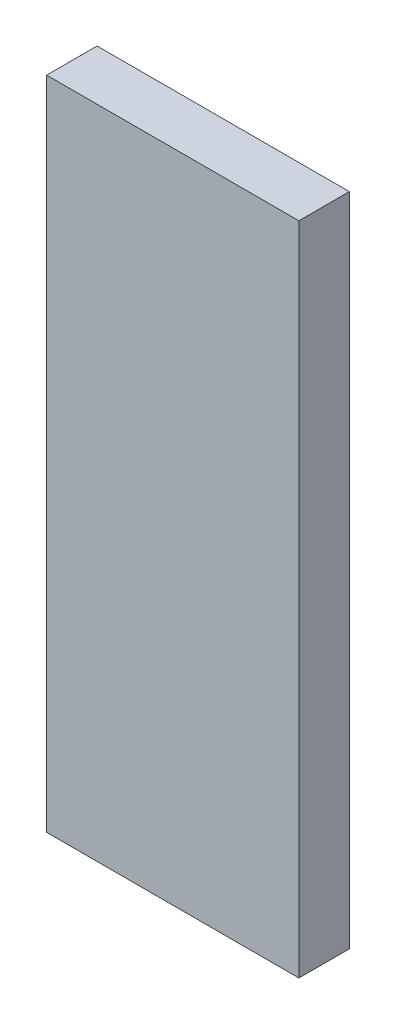
ISO-10303-21;
HEADER;
FILE_DESCRIPTION(('STEP AP214'),'2;1');
FILE_NAME('part.step','',(''),(''),'','','');
FILE_SCHEMA(('AUTOMOTIVE_DESIGN { 1 0 10303 214 1 1 1 1 }'));
ENDSEC;
DATA;
#1=APPLICATION_CONTEXT('core data for automotive mechanical design processes');
#2=APPLICATION_PROTOCOL_DEFINITION('international standard','automotive_design',2000,#1);
#3=PRODUCT_CONTEXT('',#1,'mechanical');
#4=PRODUCT('Part','Part','',(#3));
#5=PRODUCT_RELATED_PRODUCT_CATEGORY('part','',(#4));
#6=PRODUCT_DEFINITION_FORMATION('','',#4);
#7=PRODUCT_DEFINITION_CONTEXT('part definition',#1,'design');
#8=PRODUCT_DEFINITION('design','',#6,#7);
#9=PRODUCT_DEFINITION_SHAPE('','',#8);
#10=(LENGTH_UNIT() NAMED_UNIT(*) SI_UNIT(.MILLI.,.METRE.));
#11=(NAMED_UNIT(*) PLANE_ANGLE_UNIT() SI_UNIT($,.RADIAN.));
#12=(NAMED_UNIT(*) SI_UNIT($,.STERADIAN.) SOLID_ANGLE_UNIT());
#13=UNCERTAINTY_MEASURE_WITH_UNIT(LENGTH_MEASURE(1.E-05),#10,'distance_accuracy_value','');
#14=(GEOMETRIC_REPRESENTATION_CONTEXT(3) GLOBAL_UNCERTAINTY_ASSIGNED_CONTEXT((#13)) GLOBAL_UNIT_ASSIGNED_CONTEXT((#10,
#11,#12)) REPRESENTATION_CONTEXT('',''));
#15=CARTESIAN_POINT('',(0.,0.,0.));
#16=DIRECTION('',(0.,0.,1.));
#17=DIRECTION('',(1.,0.,0.));
#18=AXIS2_PLACEMENT_3D('',#15,#16,#17);
#19=CARTESIAN_POINT('',(-12.5,65.,2.5));
#20=DIRECTION('',(1.,0.,0.));
#21=DIRECTION('',(0.,0.,-1.));
#22=AXIS2_PLACEMENT_3D('',#19,#20,#21);
#23=PLANE('',#22);
#24=DIRECTION('',(0.,0.,1.));
#25=VECTOR('',#24,1.);
#26=CARTESIAN_POINT('',(-12.5,0.,2.5));
#27=LINE('',#26,#25);
#28=CARTESIAN_POINT('',(-12.5,0.,-2.5));
#29=VERTEX_POINT('',#28);
#30=CARTESIAN_POINT('',(-12.5,0.,2.5));
#31=VERTEX_POINT('',#30);
#32=EDGE_CURVE('E104',#29,#31,#27,.T.);
#33=ORIENTED_EDGE('',*,*,#32,.T.);
#34=DIRECTION('',(0.,-1.,0.));
#35=VECTOR('',#34,1.);
#36=CARTESIAN_POINT('',(-12.5,65.,2.5));
#37=LINE('',#36,#35);
#38=CARTESIAN_POINT('',(-12.5,65.,2.5));
#39=VERTEX_POINT('',#38);
#40=EDGE_CURVE('E11',#39,#31,#37,.T.);
#41=ORIENTED_EDGE('',*,*,#40,.F.);
#42=DIRECTION('',(0.,0.,1.));
#43=VECTOR('',#42,1.);
#44=CARTESIAN_POINT('',(-12.5,65.,2.5));
#45=LINE('',#44,#43);
#46=CARTESIAN_POINT('',(-12.5,65.,-2.5));
#47=VERTEX_POINT('',#46);
#48=EDGE_CURVE('E92',#47,#39,#45,.T.);
#49=ORIENTED_EDGE('',*,*,#48,.F.);
#50=DIRECTION('',(0.,-1.,0.));
#51=VECTOR('',#50,1.);
#52=CARTESIAN_POINT('',(-12.5,65.,-2.5));
#53=LINE('',#52,#51);
#54=EDGE_CURVE('E100',#47,#29,#53,.T.);
#55=ORIENTED_EDGE('',*,*,#54,.T.);
#56=EDGE_LOOP('',(#33,#41,#49,#55));
#57=FACE_BOUND('',#56,.T.);
#58=ADVANCED_FACE('F41',(#57),#23,.F.);
#59=CARTESIAN_POINT('',(12.5,65.,2.5));
#60=DIRECTION('',(0.,0.,-1.));
#61=DIRECTION('',(-1.,0.,0.));
#62=AXIS2_PLACEMENT_3D('',#59,#60,#61);
#63=PLANE('',#62);
#64=DIRECTION('',(1.,0.,0.));
#65=VECTOR('',#64,1.);
#66=CARTESIAN_POINT('',(12.5,0.,2.5));
#67=LINE('',#66,#65);
#68=CARTESIAN_POINT('',(12.5,0.,2.5));
#69=VERTEX_POINT('',#68);
#70=EDGE_CURVE('E96',#31,#69,#67,.T.);
#71=ORIENTED_EDGE('',*,*,#70,.T.);
#72=DIRECTION('',(0.,-1.,0.));
#73=VECTOR('',#72,1.);
#74=CARTESIAN_POINT('',(12.5,65.,2.5));
#75=LINE('',#74,#73);
#76=CARTESIAN_POINT('',(12.5,65.,2.5));
#77=VERTEX_POINT('',#76);
#78=EDGE_CURVE('E49',#77,#69,#75,.T.);
#79=ORIENTED_EDGE('',*,*,#78,.F.);
#80=DIRECTION('',(1.,0.,0.));
#81=VECTOR('',#80,1.);
#82=CARTESIAN_POINT('',(12.5,65.,2.5));
#83=LINE('',#82,#81);
#84=EDGE_CURVE('E87',#39,#77,#83,.T.);
#85=ORIENTED_EDGE('',*,*,#84,.F.);
#86=ORIENTED_EDGE('',*,*,#40,.T.);
#87=EDGE_LOOP('',(#71,#79,#85,#86));
#88=FACE_BOUND('',#87,.T.);
#89=ADVANCED_FACE('F95',(#88),#63,.F.);
#90=CARTESIAN_POINT('',(12.5,65.,2.5));
#91=DIRECTION('',(-1.,0.,0.));
#92=DIRECTION('',(0.,0.,1.));
#93=AXIS2_PLACEMENT_3D('',#90,#91,#92);
#94=PLANE('',#93);
#95=DIRECTION('',(0.,0.,-1.));
#96=VECTOR('',#95,1.);
#97=CARTESIAN_POINT('',(12.5,0.,2.5));
#98=LINE('',#97,#96);
#99=CARTESIAN_POINT('',(12.5,0.,-2.5));
#100=VERTEX_POINT('',#99);
#101=EDGE_CURVE('E74',#69,#100,#98,.T.);
#102=ORIENTED_EDGE('',*,*,#101,.T.);
#103=DIRECTION('',(0.,-1.,0.));
#104=VECTOR('',#103,1.);
#105=CARTESIAN_POINT('',(12.5,65.,-2.5));
#106=LINE('',#105,#104);
#107=CARTESIAN_POINT('',(12.5,65.,-2.5));
#108=VERTEX_POINT('',#107);
#109=EDGE_CURVE('E97',#108,#100,#106,.T.);
#110=ORIENTED_EDGE('',*,*,#109,.F.);
#111=DIRECTION('',(0.,0.,-1.));
#112=VECTOR('',#111,1.);
#113=CARTESIAN_POINT('',(12.5,65.,2.5));
#114=LINE('',#113,#112);
#115=EDGE_CURVE('E90',#77,#108,#114,.T.);
#116=ORIENTED_EDGE('',*,*,#115,.F.);
#117=ORIENTED_EDGE('',*,*,#78,.T.);
#118=EDGE_LOOP('',(#102,#110,#116,#117));
#119=FACE_BOUND('',#118,.T.);
#120=ADVANCED_FACE('F98',(#119),#94,.F.);
#121=CARTESIAN_POINT('',(12.5,65.,-2.5));
#122=DIRECTION('',(0.,0.,1.));
#123=DIRECTION('',(1.,0.,0.));
#124=AXIS2_PLACEMENT_3D('',#121,#122,#123);
#125=PLANE('',#124);
#126=DIRECTION('',(-1.,0.,0.));
#127=VECTOR('',#126,1.);
#128=CARTESIAN_POINT('',(12.5,0.,-2.5));
#129=LINE('',#128,#127);
#130=EDGE_CURVE('E80',#100,#29,#129,.T.);
#131=ORIENTED_EDGE('',*,*,#130,.T.);
#132=ORIENTED_EDGE('',*,*,#54,.F.);
#133=DIRECTION('',(-1.,0.,0.));
#134=VECTOR('',#133,1.);
#135=CARTESIAN_POINT('',(12.5,65.,-2.5));
#136=LINE('',#135,#134);
#137=EDGE_CURVE('E57',#108,#47,#136,.T.);
#138=ORIENTED_EDGE('',*,*,#137,.F.);
#139=ORIENTED_EDGE('',*,*,#109,.T.);
#140=EDGE_LOOP('',(#131,#132,#138,#139));
#141=FACE_BOUND('',#140,.T.);
#142=ADVANCED_FACE('F111',(#141),#125,.F.);
#143=CARTESIAN_POINT('',(0.,65.,0.));
#144=DIRECTION('',(0.,1.,0.));
#145=DIRECTION('',(0.,0.,1.));
#146=AXIS2_PLACEMENT_3D('',#143,#144,#145);
#147=PLANE('',#146);
#148=ORIENTED_EDGE('',*,*,#48,.T.);
#149=ORIENTED_EDGE('',*,*,#84,.T.);
#150=ORIENTED_EDGE('',*,*,#115,.T.);
#151=ORIENTED_EDGE('',*,*,#137,.T.);
#152=EDGE_LOOP('',(#148,#149,#150,#151));
#153=FACE_BOUND('',#152,.T.);
#154=ADVANCED_FACE('F88',(#153),#147,.T.);
#155=CARTESIAN_POINT('',(0.,0.,0.));
#156=DIRECTION('',(0.,1.,0.));
#157=DIRECTION('',(0.,0.,1.));
#158=AXIS2_PLACEMENT_3D('',#155,#156,#157);
#159=PLANE('',#158);
#160=ORIENTED_EDGE('',*,*,#32,.F.);
#161=ORIENTED_EDGE('',*,*,#130,.F.);
#162=ORIENTED_EDGE('',*,*,#101,.F.);
#163=ORIENTED_EDGE('',*,*,#70,.F.);
#164=EDGE_LOOP('',(#160,#161,#162,#163));
#165=FACE_BOUND('',#164,.T.);
#166=ADVANCED_FACE('F114',(#165),#159,.F.);
#167=CLOSED_SHELL('',(#58,#89,#120,#142,#154,#166));
#168=MANIFOLD_SOLID_BREP('B2',#167);
#169=ADVANCED_BREP_SHAPE_REPRESENTATION('',(#18,#168),#14);
#170=SHAPE_DEFINITION_REPRESENTATION(#9,#169);
ENDSEC;
END-ISO-10303-21;
